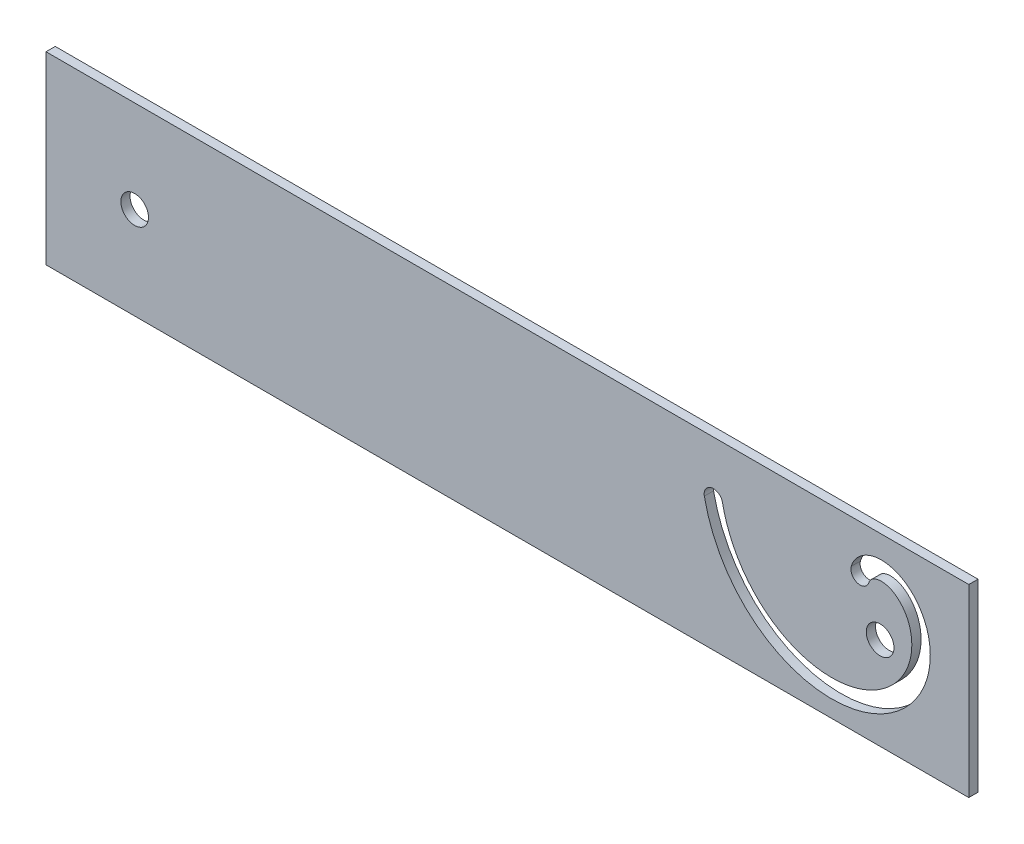
ISO-10303-21;
HEADER;
FILE_DESCRIPTION(('STEP AP214'),'2;1');
FILE_NAME('part.step','',(''),(''),'','','');
FILE_SCHEMA(('AUTOMOTIVE_DESIGN { 1 0 10303 214 1 1 1 1 }'));
ENDSEC;
DATA;
#1=APPLICATION_CONTEXT('core data for automotive mechanical design processes');
#2=APPLICATION_PROTOCOL_DEFINITION('international standard','automotive_design',2000,#1);
#3=PRODUCT_CONTEXT('',#1,'mechanical');
#4=PRODUCT('Part','Part','',(#3));
#5=PRODUCT_RELATED_PRODUCT_CATEGORY('part','',(#4));
#6=PRODUCT_DEFINITION_FORMATION('','',#4);
#7=PRODUCT_DEFINITION_CONTEXT('part definition',#1,'design');
#8=PRODUCT_DEFINITION('design','',#6,#7);
#9=PRODUCT_DEFINITION_SHAPE('','',#8);
#10=(LENGTH_UNIT() NAMED_UNIT(*) SI_UNIT(.MILLI.,.METRE.));
#11=(NAMED_UNIT(*) PLANE_ANGLE_UNIT() SI_UNIT($,.RADIAN.));
#12=(NAMED_UNIT(*) SI_UNIT($,.STERADIAN.) SOLID_ANGLE_UNIT());
#13=UNCERTAINTY_MEASURE_WITH_UNIT(LENGTH_MEASURE(1.E-05),#10,'distance_accuracy_value','');
#14=(GEOMETRIC_REPRESENTATION_CONTEXT(3) GLOBAL_UNCERTAINTY_ASSIGNED_CONTEXT((#13)) GLOBAL_UNIT_ASSIGNED_CONTEXT((#10,
#11,#12)) REPRESENTATION_CONTEXT('',''));
#15=CARTESIAN_POINT('',(0.,0.,0.));
#16=DIRECTION('',(0.,0.,1.));
#17=DIRECTION('',(1.,0.,0.));
#18=AXIS2_PLACEMENT_3D('',#15,#16,#17);
#19=CARTESIAN_POINT('',(0.,0.,-0.5));
#20=DIRECTION('',(0.,0.,1.));
#21=DIRECTION('',(1.,0.,0.));
#22=AXIS2_PLACEMENT_3D('',#19,#20,#21);
#23=PLANE('',#22);
#24=DIRECTION('',(0.,1.,0.));
#25=VECTOR('',#24,1.);
#26=CARTESIAN_POINT('',(50.,-10.,-0.5));
#27=LINE('',#26,#25);
#28=CARTESIAN_POINT('',(50.,-10.,-0.5));
#29=VERTEX_POINT('',#28);
#30=CARTESIAN_POINT('',(50.,10.,-0.5));
#31=VERTEX_POINT('',#30);
#32=EDGE_CURVE('E149',#29,#31,#27,.T.);
#33=ORIENTED_EDGE('',*,*,#32,.F.);
#34=DIRECTION('',(1.,0.,0.));
#35=VECTOR('',#34,1.);
#36=CARTESIAN_POINT('',(50.,-10.,-0.5));
#37=LINE('',#36,#35);
#38=CARTESIAN_POINT('',(-50.,-10.,-0.5));
#39=VERTEX_POINT('',#38);
#40=EDGE_CURVE('E151',#39,#29,#37,.T.);
#41=ORIENTED_EDGE('',*,*,#40,.F.);
#42=DIRECTION('',(0.,-1.,0.));
#43=VECTOR('',#42,1.);
#44=CARTESIAN_POINT('',(-50.,-10.,-0.5));
#45=LINE('',#44,#43);
#46=CARTESIAN_POINT('',(-50.,10.,-0.5));
#47=VERTEX_POINT('',#46);
#48=EDGE_CURVE('E241',#47,#39,#45,.T.);
#49=ORIENTED_EDGE('',*,*,#48,.F.);
#50=DIRECTION('',(-1.,0.,0.));
#51=VECTOR('',#50,1.);
#52=CARTESIAN_POINT('',(50.,10.,-0.5));
#53=LINE('',#52,#51);
#54=EDGE_CURVE('E152',#31,#47,#53,.T.);
#55=ORIENTED_EDGE('',*,*,#54,.F.);
#56=EDGE_LOOP('',(#33,#41,#49,#55));
#57=FACE_BOUND('',#56,.T.);
#58=CARTESIAN_POINT('',(22.3247811589463,4.16335198792339,-0.5));
#59=DIRECTION('',(0.,0.,1.));
#60=DIRECTION('',(1.,0.,0.));
#61=AXIS2_PLACEMENT_3D('',#58,#59,#60);
#62=CIRCLE('',#61,0.999999999999999);
#63=CARTESIAN_POINT('',(23.3053228420419,4.35966298535366,-0.5));
#64=VERTEX_POINT('',#63);
#65=CARTESIAN_POINT('',(21.3442394758507,3.96704099049312,-0.5));
#66=VERTEX_POINT('',#65);
#67=EDGE_CURVE('E118',#64,#66,#62,.T.);
#68=ORIENTED_EDGE('',*,*,#67,.T.);
#69=CARTESIAN_POINT('',(21.3442394758507,3.96704099049312,-0.5));
#70=CARTESIAN_POINT('',(21.5081203003167,3.14848277647314,-0.5));
#71=CARTESIAN_POINT('',(21.9674088907069,1.51859889613932,-0.5));
#72=CARTESIAN_POINT('',(23.3200640127012,-1.44199545071904,-0.5));
#73=CARTESIAN_POINT('',(25.7464188141403,-4.55740521031466,-0.5));
#74=CARTESIAN_POINT('',(29.4318638048856,-7.07445282635222,-0.5));
#75=CARTESIAN_POINT('',(33.4546775327448,-8.2672482549996,-0.5));
#76=CARTESIAN_POINT('',(37.3808313621555,-8.16629830820325,-0.5));
#77=CARTESIAN_POINT('',(41.9885078161753,-6.52806296597583,-0.5));
#78=CARTESIAN_POINT('',(45.7715971811726,-2.30217858960599,-0.5));
#79=CARTESIAN_POINT('',(46.1298263179958,3.46409940495148,-0.5));
#80=CARTESIAN_POINT('',(43.2464718245478,7.31760448789478,-0.5));
#81=CARTESIAN_POINT('',(39.2751535013622,7.94653833133167,-0.5));
#82=CARTESIAN_POINT('',(37.5398553066208,6.31975181463535,-0.5));
#83=CARTESIAN_POINT('',(37.26149563708,5.33423095045267,-0.5));
#84=B_SPLINE_CURVE_WITH_KNOTS('',3,(#69,#70,#71,#72,#73,#74,#75,#76,#77,#78,#79,#80,#81,#82,
#83),.UNSPECIFIED.,.F.,.F.,(4,1,1,1,1,1,1,1,1,1,1,1,4),(0.,0.03125,0.0625,0.125,0.1875,0.25,
0.3125,0.375,0.5,0.625,0.75,0.875,1.),.UNSPECIFIED.);
#85=CARTESIAN_POINT('',(37.26149563708,5.33423095045267,-0.5));
#86=VERTEX_POINT('',#85);
#87=EDGE_CURVE('E42',#66,#86,#84,.T.);
#88=ORIENTED_EDGE('',*,*,#87,.T.);
#89=CARTESIAN_POINT('',(38.2238451762582,5.06241600523531,-0.5));
#90=DIRECTION('',(0.,0.,1.));
#91=DIRECTION('',(1.,0.,0.));
#92=AXIS2_PLACEMENT_3D('',#89,#90,#91);
#93=CIRCLE('',#92,1.);
#94=CARTESIAN_POINT('',(39.1861947154364,4.79060106001795,-0.5));
#95=VERTEX_POINT('',#94);
#96=EDGE_CURVE('E117',#86,#95,#93,.T.);
#97=ORIENTED_EDGE('',*,*,#96,.T.);
#98=CARTESIAN_POINT('',(39.1861947154364,4.79060106001795,-0.5));
#99=CARTESIAN_POINT('',(39.2060757173171,4.86098892255073,-0.5));
#100=CARTESIAN_POINT('',(39.2624966454424,4.98840597230127,-0.5));
#101=CARTESIAN_POINT('',(39.4807723068069,5.26360774399866,-0.5));
#102=CARTESIAN_POINT('',(39.9721169756806,5.5529496129508,-0.5));
#103=CARTESIAN_POINT('',(40.8901275102088,5.61116885928204,-0.5));
#104=CARTESIAN_POINT('',(42.3462111717411,5.06472336637085,-0.5));
#105=CARTESIAN_POINT('',(44.0269021250352,2.93315908719699,-0.5));
#106=CARTESIAN_POINT('',(43.8155578352265,-1.40865323390219,-0.5));
#107=CARTESIAN_POINT('',(40.8170305812288,-4.80884967974991,-0.5));
#108=CARTESIAN_POINT('',(37.0210623220966,-6.16488518584851,-0.5));
#109=CARTESIAN_POINT('',(33.7321573030443,-6.25324082154223,-0.5));
#110=CARTESIAN_POINT('',(30.3140990647866,-5.24344253551401,-0.5));
#111=CARTESIAN_POINT('',(27.1446970821565,-3.08290981839113,-0.5));
#112=CARTESIAN_POINT('',(25.0357209730769,-0.378766084054875,-0.5));
#113=CARTESIAN_POINT('',(23.85308145035,2.20827010781102,-0.5));
#114=CARTESIAN_POINT('',(23.4491864540989,3.64108750996414,-0.5));
#115=CARTESIAN_POINT('',(23.3053228420419,4.35966298535366,-0.5));
#116=B_SPLINE_CURVE_WITH_KNOTS('',3,(#98,#99,#100,#101,#102,#103,#104,#105,#106,#107,#108,#109,
#110,#111,#112,#113,#114,#115),.UNSPECIFIED.,.F.,.F.,(4,1,1,1,1,1,1,1,1,1,1,1,1,1,1,4),(0.,
0.03125,0.0625,0.125,0.1875,0.25,0.375,0.5,0.625,0.6875,0.75,0.8125,0.875,0.9375,0.96875,1.),.UNSPECIFIED.);
#117=EDGE_CURVE('E76',#95,#64,#116,.T.);
#118=ORIENTED_EDGE('',*,*,#117,.T.);
#119=EDGE_LOOP('',(#68,#88,#97,#118));
#120=FACE_BOUND('',#119,.T.);
#121=CARTESIAN_POINT('',(-40.392058097936,0.,-0.5));
#122=DIRECTION('',(0.,0.,1.));
#123=DIRECTION('',(1.,0.,0.));
#124=AXIS2_PLACEMENT_3D('',#121,#122,#123);
#125=CIRCLE('',#124,1.5);
#126=CARTESIAN_POINT('',(-38.892058097936,0.,-0.5));
#127=VERTEX_POINT('',#126);
#128=EDGE_CURVE('E11',#127,#127,#125,.T.);
#129=ORIENTED_EDGE('',*,*,#128,.T.);
#130=EDGE_LOOP('',(#129));
#131=FACE_BOUND('',#130,.T.);
#132=CARTESIAN_POINT('',(40.392058097936,0.,-0.5));
#133=DIRECTION('',(0.,0.,-1.));
#134=DIRECTION('',(-1.,0.,0.));
#135=AXIS2_PLACEMENT_3D('',#132,#133,#134);
#136=CIRCLE('',#135,1.5);
#137=CARTESIAN_POINT('',(38.892058097936,0.,-0.5));
#138=VERTEX_POINT('',#137);
#139=EDGE_CURVE('E137',#138,#138,#136,.T.);
#140=ORIENTED_EDGE('',*,*,#139,.F.);
#141=EDGE_LOOP('',(#140));
#142=FACE_BOUND('',#141,.T.);
#143=ADVANCED_FACE('F39',(#57,#120,#131,#142),#23,.F.);
#144=CARTESIAN_POINT('',(0.,0.,0.5));
#145=DIRECTION('',(0.,0.,1.));
#146=DIRECTION('',(1.,0.,0.));
#147=AXIS2_PLACEMENT_3D('',#144,#145,#146);
#148=PLANE('',#147);
#149=CARTESIAN_POINT('',(-40.392058097936,0.,0.5));
#150=DIRECTION('',(0.,0.,1.));
#151=DIRECTION('',(1.,0.,0.));
#152=AXIS2_PLACEMENT_3D('',#149,#150,#151);
#153=CIRCLE('',#152,1.5);
#154=CARTESIAN_POINT('',(-38.892058097936,0.,0.5));
#155=VERTEX_POINT('',#154);
#156=EDGE_CURVE('E52',#155,#155,#153,.T.);
#157=ORIENTED_EDGE('',*,*,#156,.F.);
#158=EDGE_LOOP('',(#157));
#159=FACE_BOUND('',#158,.T.);
#160=CARTESIAN_POINT('',(40.392058097936,0.,0.5));
#161=DIRECTION('',(0.,0.,-1.));
#162=DIRECTION('',(-1.,0.,0.));
#163=AXIS2_PLACEMENT_3D('',#160,#161,#162);
#164=CIRCLE('',#163,1.5);
#165=CARTESIAN_POINT('',(38.892058097936,0.,0.5));
#166=VERTEX_POINT('',#165);
#167=EDGE_CURVE('E141',#166,#166,#164,.T.);
#168=ORIENTED_EDGE('',*,*,#167,.T.);
#169=EDGE_LOOP('',(#168));
#170=FACE_BOUND('',#169,.T.);
#171=CARTESIAN_POINT('',(21.3442394758507,3.96704099049312,0.5));
#172=CARTESIAN_POINT('',(21.5081203003167,3.14848277647314,0.5));
#173=CARTESIAN_POINT('',(21.9674088907069,1.51859889613932,0.5));
#174=CARTESIAN_POINT('',(23.3200640127012,-1.44199545071904,0.5));
#175=CARTESIAN_POINT('',(25.7464188141403,-4.55740521031466,0.5));
#176=CARTESIAN_POINT('',(29.4318638048856,-7.07445282635222,0.5));
#177=CARTESIAN_POINT('',(33.4546775327448,-8.2672482549996,0.5));
#178=CARTESIAN_POINT('',(37.3808313621555,-8.16629830820325,0.5));
#179=CARTESIAN_POINT('',(41.9885078161753,-6.52806296597583,0.5));
#180=CARTESIAN_POINT('',(45.7715971811726,-2.30217858960599,0.5));
#181=CARTESIAN_POINT('',(46.1298263179958,3.46409940495148,0.5));
#182=CARTESIAN_POINT('',(43.2464718245478,7.31760448789478,0.5));
#183=CARTESIAN_POINT('',(39.2751535013622,7.94653833133167,0.5));
#184=CARTESIAN_POINT('',(37.5398553066208,6.31975181463535,0.5));
#185=CARTESIAN_POINT('',(37.26149563708,5.33423095045267,0.5));
#186=B_SPLINE_CURVE_WITH_KNOTS('',3,(#171,#172,#173,#174,#175,#176,#177,#178,#179,#180,#181,
#182,#183,#184,#185),.UNSPECIFIED.,.F.,.F.,(4,1,1,1,1,1,1,1,1,1,1,1,4),(0.,0.03125,0.0625,0.125,
0.1875,0.25,0.3125,0.375,0.5,0.625,0.75,0.875,1.),.UNSPECIFIED.);
#187=CARTESIAN_POINT('',(21.3442394758507,3.96704099049312,0.5));
#188=VERTEX_POINT('',#187);
#189=CARTESIAN_POINT('',(37.26149563708,5.33423095045267,0.5));
#190=VERTEX_POINT('',#189);
#191=EDGE_CURVE('E144',#188,#190,#186,.T.);
#192=ORIENTED_EDGE('',*,*,#191,.F.);
#193=CARTESIAN_POINT('',(22.3247811589463,4.16335198792339,0.5));
#194=DIRECTION('',(0.,0.,1.));
#195=DIRECTION('',(1.,0.,0.));
#196=AXIS2_PLACEMENT_3D('',#193,#194,#195);
#197=CIRCLE('',#196,0.999999999999999);
#198=CARTESIAN_POINT('',(23.3053228420419,4.35966298535366,0.5));
#199=VERTEX_POINT('',#198);
#200=EDGE_CURVE('E133',#199,#188,#197,.T.);
#201=ORIENTED_EDGE('',*,*,#200,.F.);
#202=CARTESIAN_POINT('',(39.1861947154364,4.79060106001795,0.5));
#203=CARTESIAN_POINT('',(39.2060757173171,4.86098892255073,0.5));
#204=CARTESIAN_POINT('',(39.2624966454424,4.98840597230127,0.5));
#205=CARTESIAN_POINT('',(39.4807723068069,5.26360774399866,0.5));
#206=CARTESIAN_POINT('',(39.9721169756806,5.5529496129508,0.5));
#207=CARTESIAN_POINT('',(40.8901275102088,5.61116885928204,0.5));
#208=CARTESIAN_POINT('',(42.3462111717411,5.06472336637085,0.5));
#209=CARTESIAN_POINT('',(44.0269021250352,2.93315908719699,0.5));
#210=CARTESIAN_POINT('',(43.8155578352265,-1.40865323390219,0.5));
#211=CARTESIAN_POINT('',(40.8170305812288,-4.80884967974991,0.5));
#212=CARTESIAN_POINT('',(37.0210623220966,-6.16488518584851,0.5));
#213=CARTESIAN_POINT('',(33.7321573030443,-6.25324082154223,0.5));
#214=CARTESIAN_POINT('',(30.3140990647866,-5.24344253551401,0.5));
#215=CARTESIAN_POINT('',(27.1446970821565,-3.08290981839113,0.5));
#216=CARTESIAN_POINT('',(25.0357209730769,-0.378766084054875,0.5));
#217=CARTESIAN_POINT('',(23.85308145035,2.20827010781102,0.5));
#218=CARTESIAN_POINT('',(23.4491864540989,3.64108750996414,0.5));
#219=CARTESIAN_POINT('',(23.3053228420419,4.35966298535366,0.5));
#220=B_SPLINE_CURVE_WITH_KNOTS('',3,(#202,#203,#204,#205,#206,#207,#208,#209,#210,#211,#212,
#213,#214,#215,#216,#217,#218,#219),.UNSPECIFIED.,.F.,.F.,(4,1,1,1,1,1,1,1,1,1,1,1,1,1,1,4),(0.,
0.03125,0.0625,0.125,0.1875,0.25,0.375,0.5,0.625,0.6875,0.75,0.8125,0.875,0.9375,0.96875,1.),.UNSPECIFIED.);
#221=CARTESIAN_POINT('',(39.1861947154364,4.79060106001795,0.5));
#222=VERTEX_POINT('',#221);
#223=EDGE_CURVE('E203',#222,#199,#220,.T.);
#224=ORIENTED_EDGE('',*,*,#223,.F.);
#225=CARTESIAN_POINT('',(38.2238451762582,5.06241600523531,0.5));
#226=DIRECTION('',(0.,0.,1.));
#227=DIRECTION('',(1.,0.,0.));
#228=AXIS2_PLACEMENT_3D('',#225,#226,#227);
#229=CIRCLE('',#228,1.);
#230=EDGE_CURVE('E124',#190,#222,#229,.T.);
#231=ORIENTED_EDGE('',*,*,#230,.F.);
#232=EDGE_LOOP('',(#192,#201,#224,#231));
#233=FACE_BOUND('',#232,.T.);
#234=DIRECTION('',(0.,-1.,0.));
#235=VECTOR('',#234,1.);
#236=CARTESIAN_POINT('',(-50.,-10.,0.5));
#237=LINE('',#236,#235);
#238=CARTESIAN_POINT('',(-50.,10.,0.5));
#239=VERTEX_POINT('',#238);
#240=CARTESIAN_POINT('',(-50.,-10.,0.5));
#241=VERTEX_POINT('',#240);
#242=EDGE_CURVE('E223',#239,#241,#237,.T.);
#243=ORIENTED_EDGE('',*,*,#242,.T.);
#244=DIRECTION('',(1.,0.,0.));
#245=VECTOR('',#244,1.);
#246=CARTESIAN_POINT('',(50.,-10.,0.5));
#247=LINE('',#246,#245);
#248=CARTESIAN_POINT('',(50.,-10.,0.5));
#249=VERTEX_POINT('',#248);
#250=EDGE_CURVE('E229',#241,#249,#247,.T.);
#251=ORIENTED_EDGE('',*,*,#250,.T.);
#252=DIRECTION('',(0.,1.,0.));
#253=VECTOR('',#252,1.);
#254=CARTESIAN_POINT('',(50.,-10.,0.5));
#255=LINE('',#254,#253);
#256=CARTESIAN_POINT('',(50.,10.,0.5));
#257=VERTEX_POINT('',#256);
#258=EDGE_CURVE('E233',#249,#257,#255,.T.);
#259=ORIENTED_EDGE('',*,*,#258,.T.);
#260=DIRECTION('',(-1.,0.,0.));
#261=VECTOR('',#260,1.);
#262=CARTESIAN_POINT('',(50.,10.,0.5));
#263=LINE('',#262,#261);
#264=EDGE_CURVE('E237',#257,#239,#263,.T.);
#265=ORIENTED_EDGE('',*,*,#264,.T.);
#266=EDGE_LOOP('',(#243,#251,#259,#265));
#267=FACE_BOUND('',#266,.T.);
#268=ADVANCED_FACE('F173',(#159,#170,#233,#267),#148,.T.);
#269=CARTESIAN_POINT('',(40.392058097936,0.,0.5));
#270=DIRECTION('',(0.,0.,-1.));
#271=DIRECTION('',(-1.,0.,0.));
#272=AXIS2_PLACEMENT_3D('',#269,#270,#271);
#273=CYLINDRICAL_SURFACE('',#272,1.5);
#274=ORIENTED_EDGE('',*,*,#167,.F.);
#275=EDGE_LOOP('',(#274));
#276=FACE_BOUND('',#275,.T.);
#277=ORIENTED_EDGE('',*,*,#139,.T.);
#278=EDGE_LOOP('',(#277));
#279=FACE_BOUND('',#278,.T.);
#280=ADVANCED_FACE('F171',(#276,#279),#273,.F.);
#281=CARTESIAN_POINT('',(-40.392058097936,0.,0.5));
#282=DIRECTION('',(0.,0.,-1.));
#283=DIRECTION('',(-1.,0.,0.));
#284=AXIS2_PLACEMENT_3D('',#281,#282,#283);
#285=CYLINDRICAL_SURFACE('',#284,1.5);
#286=ORIENTED_EDGE('',*,*,#156,.T.);
#287=EDGE_LOOP('',(#286));
#288=FACE_BOUND('',#287,.T.);
#289=ORIENTED_EDGE('',*,*,#128,.F.);
#290=EDGE_LOOP('',(#289));
#291=FACE_BOUND('',#290,.T.);
#292=ADVANCED_FACE('F169',(#288,#291),#285,.F.);
#293=CARTESIAN_POINT('',(22.3247811589463,4.16335198792339,-0.5));
#294=DIRECTION('',(0.,0.,1.));
#295=DIRECTION('',(1.,0.,0.));
#296=AXIS2_PLACEMENT_3D('',#293,#294,#295);
#297=CYLINDRICAL_SURFACE('',#296,0.999999999999999);
#298=ORIENTED_EDGE('',*,*,#200,.T.);
#299=DIRECTION('',(0.,0.,1.));
#300=VECTOR('',#299,1.);
#301=CARTESIAN_POINT('',(21.3442394758507,3.96704099049312,-0.5));
#302=LINE('',#301,#300);
#303=EDGE_CURVE('E84',#66,#188,#302,.T.);
#304=ORIENTED_EDGE('',*,*,#303,.F.);
#305=ORIENTED_EDGE('',*,*,#67,.F.);
#306=DIRECTION('',(0.,0.,1.));
#307=VECTOR('',#306,1.);
#308=CARTESIAN_POINT('',(23.3053228420419,4.35966298535366,-0.5));
#309=LINE('',#308,#307);
#310=EDGE_CURVE('E114',#64,#199,#309,.T.);
#311=ORIENTED_EDGE('',*,*,#310,.T.);
#312=EDGE_LOOP('',(#298,#304,#305,#311));
#313=FACE_BOUND('',#312,.T.);
#314=ADVANCED_FACE('F166',(#313),#297,.F.);
#315=CARTESIAN_POINT('',(38.2238451762582,5.06241600523531,-0.5));
#316=DIRECTION('',(0.,0.,1.));
#317=DIRECTION('',(1.,0.,0.));
#318=AXIS2_PLACEMENT_3D('',#315,#316,#317);
#319=CYLINDRICAL_SURFACE('',#318,1.);
#320=ORIENTED_EDGE('',*,*,#230,.T.);
#321=DIRECTION('',(0.,0.,1.));
#322=VECTOR('',#321,1.);
#323=CARTESIAN_POINT('',(39.1861947154364,4.79060106001795,-0.5));
#324=LINE('',#323,#322);
#325=EDGE_CURVE('E61',#95,#222,#324,.T.);
#326=ORIENTED_EDGE('',*,*,#325,.F.);
#327=ORIENTED_EDGE('',*,*,#96,.F.);
#328=DIRECTION('',(0.,0.,1.));
#329=VECTOR('',#328,1.);
#330=CARTESIAN_POINT('',(37.26149563708,5.33423095045267,-0.5));
#331=LINE('',#330,#329);
#332=EDGE_CURVE('E127',#86,#190,#331,.T.);
#333=ORIENTED_EDGE('',*,*,#332,.T.);
#334=EDGE_LOOP('',(#320,#326,#327,#333));
#335=FACE_BOUND('',#334,.T.);
#336=ADVANCED_FACE('F121',(#335),#319,.F.);
#337=DIRECTION('',(0.,0.,1.));
#338=VECTOR('',#337,1.);
#339=SURFACE_OF_LINEAR_EXTRUSION('',#84,#338);
#340=ORIENTED_EDGE('',*,*,#191,.T.);
#341=ORIENTED_EDGE('',*,*,#332,.F.);
#342=ORIENTED_EDGE('',*,*,#87,.F.);
#343=ORIENTED_EDGE('',*,*,#303,.T.);
#344=EDGE_LOOP('',(#340,#341,#342,#343));
#345=FACE_BOUND('',#344,.T.);
#346=ADVANCED_FACE('F164',(#345),#339,.F.);
#347=DIRECTION('',(0.,0.,1.));
#348=VECTOR('',#347,1.);
#349=SURFACE_OF_LINEAR_EXTRUSION('',#116,#348);
#350=ORIENTED_EDGE('',*,*,#223,.T.);
#351=ORIENTED_EDGE('',*,*,#310,.F.);
#352=ORIENTED_EDGE('',*,*,#117,.F.);
#353=ORIENTED_EDGE('',*,*,#325,.T.);
#354=EDGE_LOOP('',(#350,#351,#352,#353));
#355=FACE_BOUND('',#354,.T.);
#356=ADVANCED_FACE('F113',(#355),#349,.F.);
#357=CARTESIAN_POINT('',(50.,10.,-0.5));
#358=DIRECTION('',(0.,1.,0.));
#359=DIRECTION('',(0.,0.,1.));
#360=AXIS2_PLACEMENT_3D('',#357,#358,#359);
#361=PLANE('',#360);
#362=DIRECTION('',(0.,0.,1.));
#363=VECTOR('',#362,1.);
#364=CARTESIAN_POINT('',(-50.,10.,-0.5));
#365=LINE('',#364,#363);
#366=EDGE_CURVE('E252',#47,#239,#365,.T.);
#367=ORIENTED_EDGE('',*,*,#366,.T.);
#368=ORIENTED_EDGE('',*,*,#264,.F.);
#369=DIRECTION('',(0.,0.,1.));
#370=VECTOR('',#369,1.);
#371=CARTESIAN_POINT('',(50.,10.,-0.5));
#372=LINE('',#371,#370);
#373=EDGE_CURVE('E255',#31,#257,#372,.T.);
#374=ORIENTED_EDGE('',*,*,#373,.F.);
#375=ORIENTED_EDGE('',*,*,#54,.T.);
#376=EDGE_LOOP('',(#367,#368,#374,#375));
#377=FACE_BOUND('',#376,.T.);
#378=ADVANCED_FACE('F163',(#377),#361,.T.);
#379=CARTESIAN_POINT('',(-50.,-10.,-0.5));
#380=DIRECTION('',(-1.,0.,0.));
#381=DIRECTION('',(0.,0.,1.));
#382=AXIS2_PLACEMENT_3D('',#379,#380,#381);
#383=PLANE('',#382);
#384=DIRECTION('',(0.,0.,1.));
#385=VECTOR('',#384,1.);
#386=CARTESIAN_POINT('',(-50.,-10.,-0.5));
#387=LINE('',#386,#385);
#388=EDGE_CURVE('E251',#39,#241,#387,.T.);
#389=ORIENTED_EDGE('',*,*,#388,.T.);
#390=ORIENTED_EDGE('',*,*,#242,.F.);
#391=ORIENTED_EDGE('',*,*,#366,.F.);
#392=ORIENTED_EDGE('',*,*,#48,.T.);
#393=EDGE_LOOP('',(#389,#390,#391,#392));
#394=FACE_BOUND('',#393,.T.);
#395=ADVANCED_FACE('F265',(#394),#383,.T.);
#396=CARTESIAN_POINT('',(50.,-10.,-0.5));
#397=DIRECTION('',(0.,-1.,0.));
#398=DIRECTION('',(0.,0.,-1.));
#399=AXIS2_PLACEMENT_3D('',#396,#397,#398);
#400=PLANE('',#399);
#401=DIRECTION('',(0.,0.,1.));
#402=VECTOR('',#401,1.);
#403=CARTESIAN_POINT('',(50.,-10.,-0.5));
#404=LINE('',#403,#402);
#405=EDGE_CURVE('E258',#29,#249,#404,.T.);
#406=ORIENTED_EDGE('',*,*,#405,.T.);
#407=ORIENTED_EDGE('',*,*,#250,.F.);
#408=ORIENTED_EDGE('',*,*,#388,.F.);
#409=ORIENTED_EDGE('',*,*,#40,.T.);
#410=EDGE_LOOP('',(#406,#407,#408,#409));
#411=FACE_BOUND('',#410,.T.);
#412=ADVANCED_FACE('F269',(#411),#400,.T.);
#413=CARTESIAN_POINT('',(50.,-10.,-0.5));
#414=DIRECTION('',(1.,0.,0.));
#415=DIRECTION('',(0.,0.,-1.));
#416=AXIS2_PLACEMENT_3D('',#413,#414,#415);
#417=PLANE('',#416);
#418=ORIENTED_EDGE('',*,*,#373,.T.);
#419=ORIENTED_EDGE('',*,*,#258,.F.);
#420=ORIENTED_EDGE('',*,*,#405,.F.);
#421=ORIENTED_EDGE('',*,*,#32,.T.);
#422=EDGE_LOOP('',(#418,#419,#420,#421));
#423=FACE_BOUND('',#422,.T.);
#424=ADVANCED_FACE('F187',(#423),#417,.T.);
#425=CLOSED_SHELL('',(#143,#268,#280,#292,#314,#336,#346,#356,#378,#395,#412,#424));
#426=MANIFOLD_SOLID_BREP('B2',#425);
#427=ADVANCED_BREP_SHAPE_REPRESENTATION('',(#18,#426),#14);
#428=SHAPE_DEFINITION_REPRESENTATION(#9,#427);
ENDSEC;
END-ISO-10303-21;
